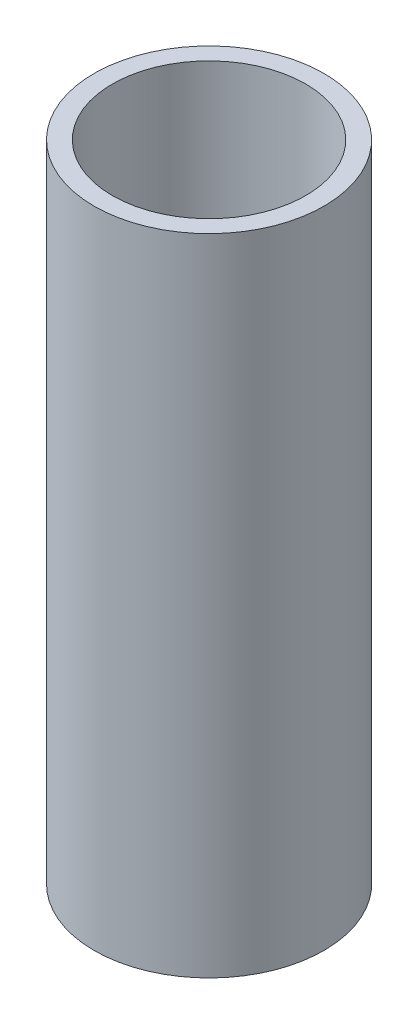
ISO-10303-21;
HEADER;
FILE_DESCRIPTION(('STEP AP214'),'2;1');
FILE_NAME('part.step','',(''),(''),'','','');
FILE_SCHEMA(('AUTOMOTIVE_DESIGN { 1 0 10303 214 1 1 1 1 }'));
ENDSEC;
DATA;
#1=APPLICATION_CONTEXT('core data for automotive mechanical design processes');
#2=APPLICATION_PROTOCOL_DEFINITION('international standard','automotive_design',2000,#1);
#3=PRODUCT_CONTEXT('',#1,'mechanical');
#4=PRODUCT('Part','Part','',(#3));
#5=PRODUCT_RELATED_PRODUCT_CATEGORY('part','',(#4));
#6=PRODUCT_DEFINITION_FORMATION('','',#4);
#7=PRODUCT_DEFINITION_CONTEXT('part definition',#1,'design');
#8=PRODUCT_DEFINITION('design','',#6,#7);
#9=PRODUCT_DEFINITION_SHAPE('','',#8);
#10=(LENGTH_UNIT() NAMED_UNIT(*) SI_UNIT(.MILLI.,.METRE.));
#11=(NAMED_UNIT(*) PLANE_ANGLE_UNIT() SI_UNIT($,.RADIAN.));
#12=(NAMED_UNIT(*) SI_UNIT($,.STERADIAN.) SOLID_ANGLE_UNIT());
#13=UNCERTAINTY_MEASURE_WITH_UNIT(LENGTH_MEASURE(1.E-05),#10,'distance_accuracy_value','');
#14=(GEOMETRIC_REPRESENTATION_CONTEXT(3) GLOBAL_UNCERTAINTY_ASSIGNED_CONTEXT((#13)) GLOBAL_UNIT_ASSIGNED_CONTEXT((#10,
#11,#12)) REPRESENTATION_CONTEXT('',''));
#15=CARTESIAN_POINT('',(0.,0.,0.));
#16=DIRECTION('',(0.,0.,1.));
#17=DIRECTION('',(1.,0.,0.));
#18=AXIS2_PLACEMENT_3D('',#15,#16,#17);
#19=CARTESIAN_POINT('',(0.,3.,0.));
#20=DIRECTION('',(0.,1.,0.));
#21=DIRECTION('',(0.,0.,1.));
#22=AXIS2_PLACEMENT_3D('',#19,#20,#21);
#23=PLANE('',#22);
#24=CARTESIAN_POINT('',(0.,3.,0.));
#25=DIRECTION('',(0.,1.,0.));
#26=DIRECTION('',(0.,0.,1.));
#27=AXIS2_PLACEMENT_3D('',#24,#25,#26);
#28=CIRCLE('',#27,0.535);
#29=CARTESIAN_POINT('',(0.,3.,0.535));
#30=VERTEX_POINT('',#29);
#31=EDGE_CURVE('E10',#30,#30,#28,.T.);
#32=ORIENTED_EDGE('',*,*,#31,.T.);
#33=EDGE_LOOP('',(#32));
#34=FACE_BOUND('',#33,.T.);
#35=CARTESIAN_POINT('',(0.,3.,0.));
#36=DIRECTION('',(0.,1.,0.));
#37=DIRECTION('',(0.,0.,1.));
#38=AXIS2_PLACEMENT_3D('',#35,#36,#37);
#39=CIRCLE('',#38,0.45);
#40=CARTESIAN_POINT('',(0.,3.,0.45));
#41=VERTEX_POINT('',#40);
#42=EDGE_CURVE('E44',#41,#41,#39,.T.);
#43=ORIENTED_EDGE('',*,*,#42,.F.);
#44=EDGE_LOOP('',(#43));
#45=FACE_BOUND('',#44,.T.);
#46=ADVANCED_FACE('F33',(#34,#45),#23,.T.);
#47=CARTESIAN_POINT('',(0.,0.,0.));
#48=DIRECTION('',(0.,1.,0.));
#49=DIRECTION('',(0.,0.,1.));
#50=AXIS2_PLACEMENT_3D('',#47,#48,#49);
#51=PLANE('',#50);
#52=CARTESIAN_POINT('',(0.,0.,0.));
#53=DIRECTION('',(0.,1.,0.));
#54=DIRECTION('',(0.,0.,1.));
#55=AXIS2_PLACEMENT_3D('',#52,#53,#54);
#56=CIRCLE('',#55,0.535);
#57=CARTESIAN_POINT('',(0.,0.,0.535));
#58=VERTEX_POINT('',#57);
#59=EDGE_CURVE('E37',#58,#58,#56,.T.);
#60=ORIENTED_EDGE('',*,*,#59,.F.);
#61=EDGE_LOOP('',(#60));
#62=FACE_BOUND('',#61,.T.);
#63=CARTESIAN_POINT('',(0.,0.,0.));
#64=DIRECTION('',(0.,1.,0.));
#65=DIRECTION('',(0.,0.,1.));
#66=AXIS2_PLACEMENT_3D('',#63,#64,#65);
#67=CIRCLE('',#66,0.45);
#68=CARTESIAN_POINT('',(0.,0.,0.45));
#69=VERTEX_POINT('',#68);
#70=EDGE_CURVE('E46',#69,#69,#67,.T.);
#71=ORIENTED_EDGE('',*,*,#70,.T.);
#72=EDGE_LOOP('',(#71));
#73=FACE_BOUND('',#72,.T.);
#74=ADVANCED_FACE('F56',(#62,#73),#51,.F.);
#75=CARTESIAN_POINT('',(0.,3.,0.));
#76=DIRECTION('',(0.,-1.,0.));
#77=DIRECTION('',(0.,0.,-1.));
#78=AXIS2_PLACEMENT_3D('',#75,#76,#77);
#79=CYLINDRICAL_SURFACE('',#78,0.535);
#80=ORIENTED_EDGE('',*,*,#31,.F.);
#81=EDGE_LOOP('',(#80));
#82=FACE_BOUND('',#81,.T.);
#83=ORIENTED_EDGE('',*,*,#59,.T.);
#84=EDGE_LOOP('',(#83));
#85=FACE_BOUND('',#84,.T.);
#86=ADVANCED_FACE('F35',(#82,#85),#79,.T.);
#87=CARTESIAN_POINT('',(0.,3.,0.));
#88=DIRECTION('',(0.,-1.,0.));
#89=DIRECTION('',(0.,0.,-1.));
#90=AXIS2_PLACEMENT_3D('',#87,#88,#89);
#91=CYLINDRICAL_SURFACE('',#90,0.45);
#92=ORIENTED_EDGE('',*,*,#42,.T.);
#93=EDGE_LOOP('',(#92));
#94=FACE_BOUND('',#93,.T.);
#95=ORIENTED_EDGE('',*,*,#70,.F.);
#96=EDGE_LOOP('',(#95));
#97=FACE_BOUND('',#96,.T.);
#98=ADVANCED_FACE('F52',(#94,#97),#91,.F.);
#99=CLOSED_SHELL('',(#46,#74,#86,#98));
#100=MANIFOLD_SOLID_BREP('B2',#99);
#101=ADVANCED_BREP_SHAPE_REPRESENTATION('',(#18,#100),#14);
#102=SHAPE_DEFINITION_REPRESENTATION(#9,#101);
ENDSEC;
END-ISO-10303-21;
